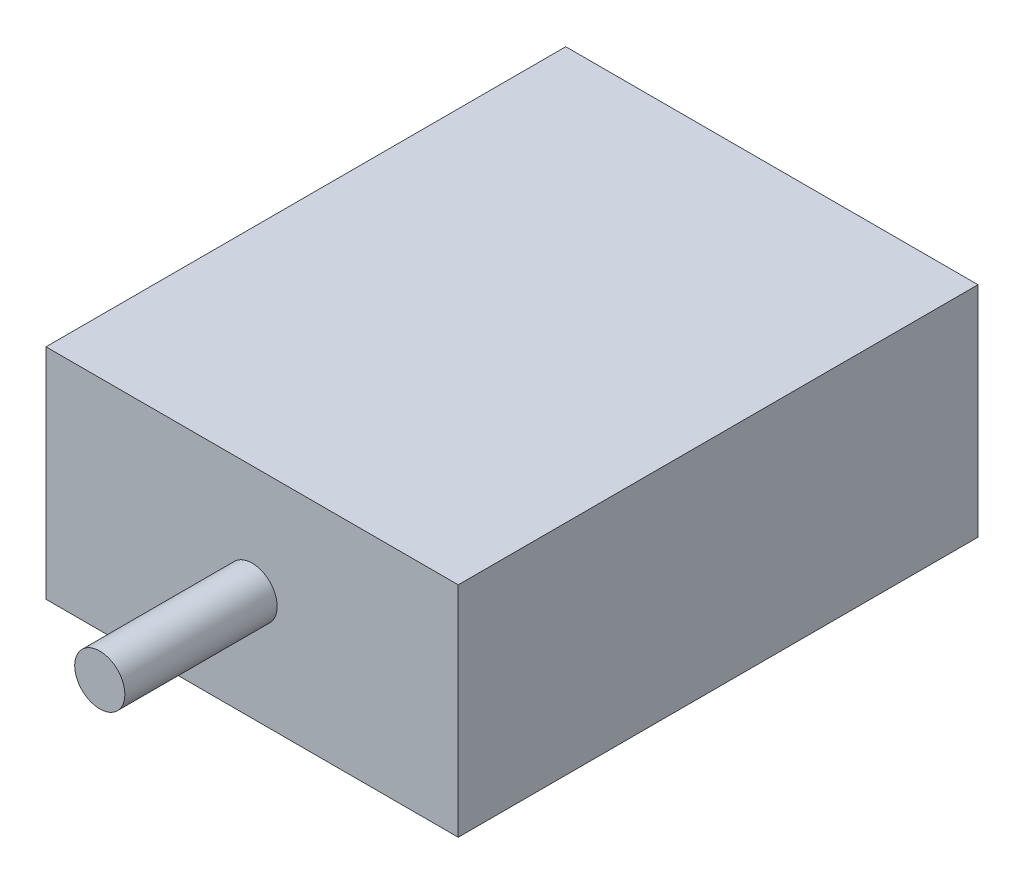
ISO-10303-21;
HEADER;
FILE_DESCRIPTION(('STEP AP214'),'2;1');
FILE_NAME('part.step','',(''),(''),'','','');
FILE_SCHEMA(('AUTOMOTIVE_DESIGN { 1 0 10303 214 1 1 1 1 }'));
ENDSEC;
DATA;
#1=APPLICATION_CONTEXT('core data for automotive mechanical design processes');
#2=APPLICATION_PROTOCOL_DEFINITION('international standard','automotive_design',2000,#1);
#3=PRODUCT_CONTEXT('',#1,'mechanical');
#4=PRODUCT('Part','Part','',(#3));
#5=PRODUCT_RELATED_PRODUCT_CATEGORY('part','',(#4));
#6=PRODUCT_DEFINITION_FORMATION('','',#4);
#7=PRODUCT_DEFINITION_CONTEXT('part definition',#1,'design');
#8=PRODUCT_DEFINITION('design','',#6,#7);
#9=PRODUCT_DEFINITION_SHAPE('','',#8);
#10=(LENGTH_UNIT() NAMED_UNIT(*) SI_UNIT(.MILLI.,.METRE.));
#11=(NAMED_UNIT(*) PLANE_ANGLE_UNIT() SI_UNIT($,.RADIAN.));
#12=(NAMED_UNIT(*) SI_UNIT($,.STERADIAN.) SOLID_ANGLE_UNIT());
#13=UNCERTAINTY_MEASURE_WITH_UNIT(LENGTH_MEASURE(1.E-05),#10,'distance_accuracy_value','');
#14=(GEOMETRIC_REPRESENTATION_CONTEXT(3) GLOBAL_UNCERTAINTY_ASSIGNED_CONTEXT((#13)) GLOBAL_UNIT_ASSIGNED_CONTEXT((#10,
#11,#12)) REPRESENTATION_CONTEXT('',''));
#15=CARTESIAN_POINT('',(0.,0.,0.));
#16=DIRECTION('',(0.,0.,1.));
#17=DIRECTION('',(1.,0.,0.));
#18=AXIS2_PLACEMENT_3D('',#15,#16,#17);
#19=CARTESIAN_POINT('',(-11.5,-6.1,29.));
#20=DIRECTION('',(1.,0.,0.));
#21=DIRECTION('',(0.,0.,-1.));
#22=AXIS2_PLACEMENT_3D('',#19,#20,#21);
#23=PLANE('',#22);
#24=DIRECTION('',(0.,-1.,0.));
#25=VECTOR('',#24,1.);
#26=CARTESIAN_POINT('',(-11.5,-6.1,0.));
#27=LINE('',#26,#25);
#28=CARTESIAN_POINT('',(-11.5,6.1,0.));
#29=VERTEX_POINT('',#28);
#30=CARTESIAN_POINT('',(-11.5,-6.1,0.));
#31=VERTEX_POINT('',#30);
#32=EDGE_CURVE('E109',#29,#31,#27,.T.);
#33=ORIENTED_EDGE('',*,*,#32,.T.);
#34=DIRECTION('',(0.,0.,-1.));
#35=VECTOR('',#34,1.);
#36=CARTESIAN_POINT('',(-11.5,-6.1,29.));
#37=LINE('',#36,#35);
#38=CARTESIAN_POINT('',(-11.5,-6.1,29.));
#39=VERTEX_POINT('',#38);
#40=EDGE_CURVE('E51',#39,#31,#37,.T.);
#41=ORIENTED_EDGE('',*,*,#40,.F.);
#42=DIRECTION('',(0.,-1.,0.));
#43=VECTOR('',#42,1.);
#44=CARTESIAN_POINT('',(-11.5,-6.1,29.));
#45=LINE('',#44,#43);
#46=CARTESIAN_POINT('',(-11.5,6.1,29.));
#47=VERTEX_POINT('',#46);
#48=EDGE_CURVE('E95',#47,#39,#45,.T.);
#49=ORIENTED_EDGE('',*,*,#48,.F.);
#50=DIRECTION('',(0.,0.,-1.));
#51=VECTOR('',#50,1.);
#52=CARTESIAN_POINT('',(-11.5,6.1,29.));
#53=LINE('',#52,#51);
#54=EDGE_CURVE('E105',#47,#29,#53,.T.);
#55=ORIENTED_EDGE('',*,*,#54,.T.);
#56=EDGE_LOOP('',(#33,#41,#49,#55));
#57=FACE_BOUND('',#56,.T.);
#58=ADVANCED_FACE('F43',(#57),#23,.F.);
#59=CARTESIAN_POINT('',(-11.5,-6.1,29.));
#60=DIRECTION('',(0.,1.,0.));
#61=DIRECTION('',(0.,0.,1.));
#62=AXIS2_PLACEMENT_3D('',#59,#60,#61);
#63=PLANE('',#62);
#64=DIRECTION('',(1.,0.,0.));
#65=VECTOR('',#64,1.);
#66=CARTESIAN_POINT('',(-11.5,-6.1,0.));
#67=LINE('',#66,#65);
#68=CARTESIAN_POINT('',(11.5,-6.1,0.));
#69=VERTEX_POINT('',#68);
#70=EDGE_CURVE('E100',#31,#69,#67,.T.);
#71=ORIENTED_EDGE('',*,*,#70,.T.);
#72=DIRECTION('',(0.,0.,-1.));
#73=VECTOR('',#72,1.);
#74=CARTESIAN_POINT('',(11.5,-6.1,29.));
#75=LINE('',#74,#73);
#76=CARTESIAN_POINT('',(11.5,-6.1,29.));
#77=VERTEX_POINT('',#76);
#78=EDGE_CURVE('E98',#77,#69,#75,.T.);
#79=ORIENTED_EDGE('',*,*,#78,.F.);
#80=DIRECTION('',(1.,0.,0.));
#81=VECTOR('',#80,1.);
#82=CARTESIAN_POINT('',(-11.5,-6.1,29.));
#83=LINE('',#82,#81);
#84=EDGE_CURVE('E90',#39,#77,#83,.T.);
#85=ORIENTED_EDGE('',*,*,#84,.F.);
#86=ORIENTED_EDGE('',*,*,#40,.T.);
#87=EDGE_LOOP('',(#71,#79,#85,#86));
#88=FACE_BOUND('',#87,.T.);
#89=ADVANCED_FACE('F99',(#88),#63,.F.);
#90=CARTESIAN_POINT('',(11.5,-6.1,29.));
#91=DIRECTION('',(-1.,0.,0.));
#92=DIRECTION('',(0.,0.,1.));
#93=AXIS2_PLACEMENT_3D('',#90,#91,#92);
#94=PLANE('',#93);
#95=DIRECTION('',(0.,1.,0.));
#96=VECTOR('',#95,1.);
#97=CARTESIAN_POINT('',(11.5,-6.1,0.));
#98=LINE('',#97,#96);
#99=CARTESIAN_POINT('',(11.5,6.1,0.));
#100=VERTEX_POINT('',#99);
#101=EDGE_CURVE('E76',#69,#100,#98,.T.);
#102=ORIENTED_EDGE('',*,*,#101,.T.);
#103=DIRECTION('',(0.,0.,-1.));
#104=VECTOR('',#103,1.);
#105=CARTESIAN_POINT('',(11.5,6.1,29.));
#106=LINE('',#105,#104);
#107=CARTESIAN_POINT('',(11.5,6.1,29.));
#108=VERTEX_POINT('',#107);
#109=EDGE_CURVE('E101',#108,#100,#106,.T.);
#110=ORIENTED_EDGE('',*,*,#109,.F.);
#111=DIRECTION('',(0.,1.,0.));
#112=VECTOR('',#111,1.);
#113=CARTESIAN_POINT('',(11.5,-6.1,29.));
#114=LINE('',#113,#112);
#115=EDGE_CURVE('E93',#77,#108,#114,.T.);
#116=ORIENTED_EDGE('',*,*,#115,.F.);
#117=ORIENTED_EDGE('',*,*,#78,.T.);
#118=EDGE_LOOP('',(#102,#110,#116,#117));
#119=FACE_BOUND('',#118,.T.);
#120=ADVANCED_FACE('F103',(#119),#94,.F.);
#121=CARTESIAN_POINT('',(-11.5,6.1,29.));
#122=DIRECTION('',(0.,-1.,0.));
#123=DIRECTION('',(0.,0.,-1.));
#124=AXIS2_PLACEMENT_3D('',#121,#122,#123);
#125=PLANE('',#124);
#126=DIRECTION('',(-1.,0.,0.));
#127=VECTOR('',#126,1.);
#128=CARTESIAN_POINT('',(-11.5,6.1,0.));
#129=LINE('',#128,#127);
#130=EDGE_CURVE('E82',#100,#29,#129,.T.);
#131=ORIENTED_EDGE('',*,*,#130,.T.);
#132=ORIENTED_EDGE('',*,*,#54,.F.);
#133=DIRECTION('',(-1.,0.,0.));
#134=VECTOR('',#133,1.);
#135=CARTESIAN_POINT('',(-11.5,6.1,29.));
#136=LINE('',#135,#134);
#137=EDGE_CURVE('E59',#108,#47,#136,.T.);
#138=ORIENTED_EDGE('',*,*,#137,.F.);
#139=ORIENTED_EDGE('',*,*,#109,.T.);
#140=EDGE_LOOP('',(#131,#132,#138,#139));
#141=FACE_BOUND('',#140,.T.);
#142=ADVANCED_FACE('F132',(#141),#125,.F.);
#143=CARTESIAN_POINT('',(0.,0.,29.));
#144=DIRECTION('',(0.,0.,-1.));
#145=DIRECTION('',(-1.,0.,0.));
#146=AXIS2_PLACEMENT_3D('',#143,#144,#145);
#147=PLANE('',#146);
#148=CARTESIAN_POINT('',(0.,0.,29.));
#149=DIRECTION('',(0.,0.,-1.));
#150=DIRECTION('',(-1.,0.,0.));
#151=AXIS2_PLACEMENT_3D('',#148,#149,#150);
#152=CIRCLE('',#151,1.4);
#153=CARTESIAN_POINT('',(-1.4,0.,29.));
#154=VERTEX_POINT('',#153);
#155=EDGE_CURVE('E11',#154,#154,#152,.F.);
#156=ORIENTED_EDGE('',*,*,#155,.F.);
#157=EDGE_LOOP('',(#156));
#158=FACE_BOUND('',#157,.T.);
#159=ORIENTED_EDGE('',*,*,#48,.T.);
#160=ORIENTED_EDGE('',*,*,#84,.T.);
#161=ORIENTED_EDGE('',*,*,#115,.T.);
#162=ORIENTED_EDGE('',*,*,#137,.T.);
#163=EDGE_LOOP('',(#159,#160,#161,#162));
#164=FACE_BOUND('',#163,.T.);
#165=ADVANCED_FACE('F91',(#158,#164),#147,.F.);
#166=CARTESIAN_POINT('',(0.,0.,0.));
#167=DIRECTION('',(0.,0.,-1.));
#168=DIRECTION('',(-1.,0.,0.));
#169=AXIS2_PLACEMENT_3D('',#166,#167,#168);
#170=PLANE('',#169);
#171=ORIENTED_EDGE('',*,*,#32,.F.);
#172=ORIENTED_EDGE('',*,*,#130,.F.);
#173=ORIENTED_EDGE('',*,*,#101,.F.);
#174=ORIENTED_EDGE('',*,*,#70,.F.);
#175=EDGE_LOOP('',(#171,#172,#173,#174));
#176=FACE_BOUND('',#175,.T.);
#177=ADVANCED_FACE('F120',(#176),#170,.T.);
#178=CARTESIAN_POINT('',(0.,0.,37.5));
#179=DIRECTION('',(0.,0.,-1.));
#180=DIRECTION('',(-1.,0.,0.));
#181=AXIS2_PLACEMENT_3D('',#178,#179,#180);
#182=CYLINDRICAL_SURFACE('',#181,1.4);
#183=CARTESIAN_POINT('',(0.,0.,37.5));
#184=DIRECTION('',(0.,0.,1.));
#185=DIRECTION('',(1.,0.,0.));
#186=AXIS2_PLACEMENT_3D('',#183,#184,#185);
#187=CIRCLE('',#186,1.4);
#188=CARTESIAN_POINT('',(1.4,0.,37.5));
#189=VERTEX_POINT('',#188);
#190=EDGE_CURVE('E112',#189,#189,#187,.T.);
#191=ORIENTED_EDGE('',*,*,#190,.F.);
#192=EDGE_LOOP('',(#191));
#193=FACE_BOUND('',#192,.T.);
#194=ORIENTED_EDGE('',*,*,#155,.T.);
#195=EDGE_LOOP('',(#194));
#196=FACE_BOUND('',#195,.T.);
#197=ADVANCED_FACE('F122',(#193,#196),#182,.T.);
#198=CARTESIAN_POINT('',(0.,0.,37.5));
#199=DIRECTION('',(0.,0.,1.));
#200=DIRECTION('',(1.,0.,0.));
#201=AXIS2_PLACEMENT_3D('',#198,#199,#200);
#202=PLANE('',#201);
#203=ORIENTED_EDGE('',*,*,#190,.T.);
#204=EDGE_LOOP('',(#203));
#205=FACE_BOUND('',#204,.T.);
#206=ADVANCED_FACE('F129',(#205),#202,.T.);
#207=CLOSED_SHELL('',(#58,#89,#120,#142,#165,#177,#197,#206));
#208=MANIFOLD_SOLID_BREP('B2',#207);
#209=ADVANCED_BREP_SHAPE_REPRESENTATION('',(#18,#208),#14);
#210=SHAPE_DEFINITION_REPRESENTATION(#9,#209);
ENDSEC;
END-ISO-10303-21;
